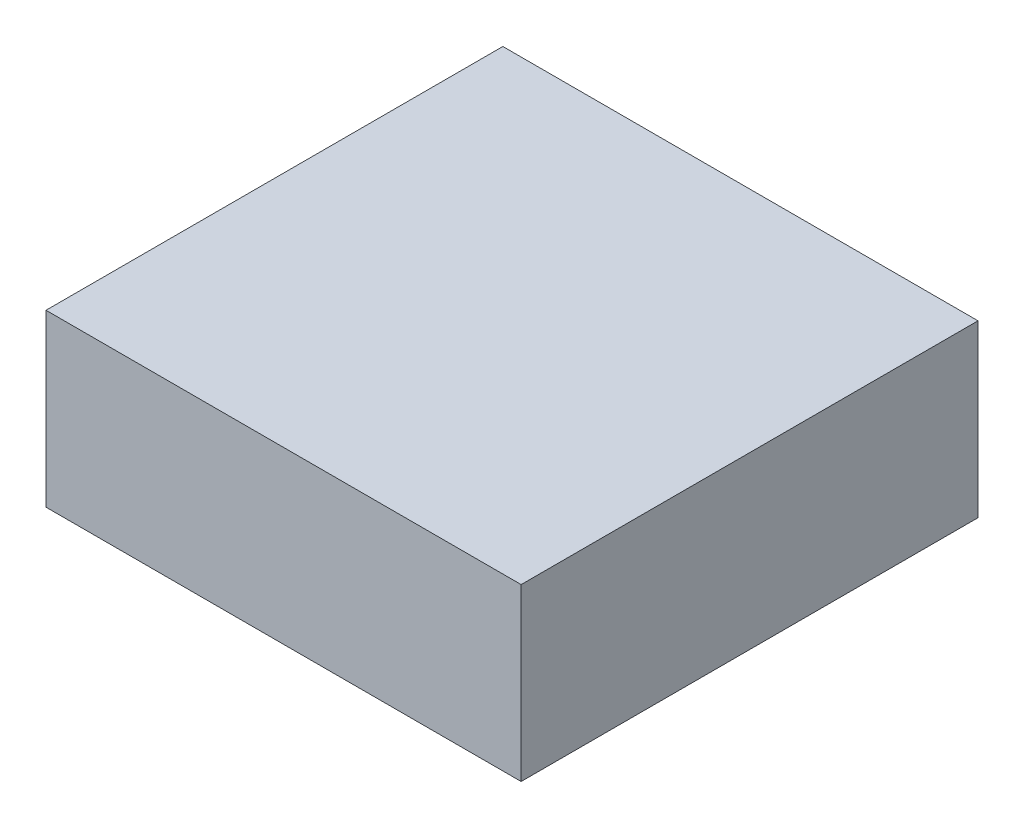
ISO-10303-21;
HEADER;
FILE_DESCRIPTION(('STEP AP214'),'2;1');
FILE_NAME('part.step','',(''),(''),'','','');
FILE_SCHEMA(('AUTOMOTIVE_DESIGN { 1 0 10303 214 1 1 1 1 }'));
ENDSEC;
DATA;
#1=APPLICATION_CONTEXT('core data for automotive mechanical design processes');
#2=APPLICATION_PROTOCOL_DEFINITION('international standard','automotive_design',2000,#1);
#3=PRODUCT_CONTEXT('',#1,'mechanical');
#4=PRODUCT('Part','Part','',(#3));
#5=PRODUCT_RELATED_PRODUCT_CATEGORY('part','',(#4));
#6=PRODUCT_DEFINITION_FORMATION('','',#4);
#7=PRODUCT_DEFINITION_CONTEXT('part definition',#1,'design');
#8=PRODUCT_DEFINITION('design','',#6,#7);
#9=PRODUCT_DEFINITION_SHAPE('','',#8);
#10=(LENGTH_UNIT() NAMED_UNIT(*) SI_UNIT(.MILLI.,.METRE.));
#11=(NAMED_UNIT(*) PLANE_ANGLE_UNIT() SI_UNIT($,.RADIAN.));
#12=(NAMED_UNIT(*) SI_UNIT($,.STERADIAN.) SOLID_ANGLE_UNIT());
#13=UNCERTAINTY_MEASURE_WITH_UNIT(LENGTH_MEASURE(1.E-05),#10,'distance_accuracy_value','');
#14=(GEOMETRIC_REPRESENTATION_CONTEXT(3) GLOBAL_UNCERTAINTY_ASSIGNED_CONTEXT((#13)) GLOBAL_UNIT_ASSIGNED_CONTEXT((#10,
#11,#12)) REPRESENTATION_CONTEXT('',''));
#15=CARTESIAN_POINT('',(0.,0.,0.));
#16=DIRECTION('',(0.,0.,1.));
#17=DIRECTION('',(1.,0.,0.));
#18=AXIS2_PLACEMENT_3D('',#15,#16,#17);
#19=CARTESIAN_POINT('',(0.,28.,-75.));
#20=DIRECTION('',(0.,0.,-1.));
#21=DIRECTION('',(-1.,0.,0.));
#22=AXIS2_PLACEMENT_3D('',#19,#20,#21);
#23=PLANE('',#22);
#24=DIRECTION('',(1.,0.,0.));
#25=VECTOR('',#24,1.);
#26=CARTESIAN_POINT('',(0.,0.,-75.));
#27=LINE('',#26,#25);
#28=CARTESIAN_POINT('',(0.,0.,-75.));
#29=VERTEX_POINT('',#28);
#30=CARTESIAN_POINT('',(78.,0.,-75.));
#31=VERTEX_POINT('',#30);
#32=EDGE_CURVE('E98',#29,#31,#27,.T.);
#33=ORIENTED_EDGE('',*,*,#32,.F.);
#34=DIRECTION('',(0.,-1.,0.));
#35=VECTOR('',#34,1.);
#36=CARTESIAN_POINT('',(0.,28.,-75.));
#37=LINE('',#36,#35);
#38=CARTESIAN_POINT('',(0.,28.,-75.));
#39=VERTEX_POINT('',#38);
#40=EDGE_CURVE('E11',#39,#29,#37,.T.);
#41=ORIENTED_EDGE('',*,*,#40,.F.);
#42=DIRECTION('',(1.,0.,0.));
#43=VECTOR('',#42,1.);
#44=CARTESIAN_POINT('',(0.,28.,-75.));
#45=LINE('',#44,#43);
#46=CARTESIAN_POINT('',(78.,28.,-75.));
#47=VERTEX_POINT('',#46);
#48=EDGE_CURVE('E92',#39,#47,#45,.T.);
#49=ORIENTED_EDGE('',*,*,#48,.T.);
#50=DIRECTION('',(0.,-1.,0.));
#51=VECTOR('',#50,1.);
#52=CARTESIAN_POINT('',(78.,28.,-75.));
#53=LINE('',#52,#51);
#54=EDGE_CURVE('E37',#47,#31,#53,.T.);
#55=ORIENTED_EDGE('',*,*,#54,.T.);
#56=EDGE_LOOP('',(#33,#41,#49,#55));
#57=FACE_BOUND('',#56,.T.);
#58=ADVANCED_FACE('F34',(#57),#23,.T.);
#59=CARTESIAN_POINT('',(0.,28.,0.));
#60=DIRECTION('',(-1.,0.,0.));
#61=DIRECTION('',(0.,0.,1.));
#62=AXIS2_PLACEMENT_3D('',#59,#60,#61);
#63=PLANE('',#62);
#64=DIRECTION('',(0.,0.,-1.));
#65=VECTOR('',#64,1.);
#66=CARTESIAN_POINT('',(0.,0.,0.));
#67=LINE('',#66,#65);
#68=CARTESIAN_POINT('',(0.,0.,0.));
#69=VERTEX_POINT('',#68);
#70=EDGE_CURVE('E94',#69,#29,#67,.T.);
#71=ORIENTED_EDGE('',*,*,#70,.F.);
#72=DIRECTION('',(0.,-1.,0.));
#73=VECTOR('',#72,1.);
#74=CARTESIAN_POINT('',(0.,28.,0.));
#75=LINE('',#74,#73);
#76=CARTESIAN_POINT('',(0.,28.,0.));
#77=VERTEX_POINT('',#76);
#78=EDGE_CURVE('E43',#77,#69,#75,.T.);
#79=ORIENTED_EDGE('',*,*,#78,.F.);
#80=DIRECTION('',(0.,0.,-1.));
#81=VECTOR('',#80,1.);
#82=CARTESIAN_POINT('',(0.,28.,0.));
#83=LINE('',#82,#81);
#84=EDGE_CURVE('E82',#77,#39,#83,.T.);
#85=ORIENTED_EDGE('',*,*,#84,.T.);
#86=ORIENTED_EDGE('',*,*,#40,.T.);
#87=EDGE_LOOP('',(#71,#79,#85,#86));
#88=FACE_BOUND('',#87,.T.);
#89=ADVANCED_FACE('F108',(#88),#63,.T.);
#90=CARTESIAN_POINT('',(0.,28.,0.));
#91=DIRECTION('',(0.,0.,-1.));
#92=DIRECTION('',(-1.,0.,0.));
#93=AXIS2_PLACEMENT_3D('',#90,#91,#92);
#94=PLANE('',#93);
#95=DIRECTION('',(1.,0.,0.));
#96=VECTOR('',#95,1.);
#97=CARTESIAN_POINT('',(0.,0.,0.));
#98=LINE('',#97,#96);
#99=CARTESIAN_POINT('',(78.,0.,0.));
#100=VERTEX_POINT('',#99);
#101=EDGE_CURVE('E87',#69,#100,#98,.T.);
#102=ORIENTED_EDGE('',*,*,#101,.T.);
#103=DIRECTION('',(0.,-1.,0.));
#104=VECTOR('',#103,1.);
#105=CARTESIAN_POINT('',(78.,28.,0.));
#106=LINE('',#105,#104);
#107=CARTESIAN_POINT('',(78.,28.,0.));
#108=VERTEX_POINT('',#107);
#109=EDGE_CURVE('E85',#108,#100,#106,.T.);
#110=ORIENTED_EDGE('',*,*,#109,.F.);
#111=DIRECTION('',(1.,0.,0.));
#112=VECTOR('',#111,1.);
#113=CARTESIAN_POINT('',(0.,28.,0.));
#114=LINE('',#113,#112);
#115=EDGE_CURVE('E79',#77,#108,#114,.T.);
#116=ORIENTED_EDGE('',*,*,#115,.F.);
#117=ORIENTED_EDGE('',*,*,#78,.T.);
#118=EDGE_LOOP('',(#102,#110,#116,#117));
#119=FACE_BOUND('',#118,.T.);
#120=ADVANCED_FACE('F86',(#119),#94,.F.);
#121=CARTESIAN_POINT('',(78.,28.,0.));
#122=DIRECTION('',(-1.,0.,0.));
#123=DIRECTION('',(0.,0.,1.));
#124=AXIS2_PLACEMENT_3D('',#121,#122,#123);
#125=PLANE('',#124);
#126=DIRECTION('',(0.,0.,-1.));
#127=VECTOR('',#126,1.);
#128=CARTESIAN_POINT('',(78.,0.,0.));
#129=LINE('',#128,#127);
#130=EDGE_CURVE('E101',#100,#31,#129,.T.);
#131=ORIENTED_EDGE('',*,*,#130,.T.);
#132=ORIENTED_EDGE('',*,*,#54,.F.);
#133=DIRECTION('',(0.,0.,-1.));
#134=VECTOR('',#133,1.);
#135=CARTESIAN_POINT('',(78.,28.,0.));
#136=LINE('',#135,#134);
#137=EDGE_CURVE('E76',#108,#47,#136,.T.);
#138=ORIENTED_EDGE('',*,*,#137,.F.);
#139=ORIENTED_EDGE('',*,*,#109,.T.);
#140=EDGE_LOOP('',(#131,#132,#138,#139));
#141=FACE_BOUND('',#140,.T.);
#142=ADVANCED_FACE('F91',(#141),#125,.F.);
#143=CARTESIAN_POINT('',(0.,28.,0.));
#144=DIRECTION('',(0.,1.,0.));
#145=DIRECTION('',(0.,0.,1.));
#146=AXIS2_PLACEMENT_3D('',#143,#144,#145);
#147=PLANE('',#146);
#148=ORIENTED_EDGE('',*,*,#48,.F.);
#149=ORIENTED_EDGE('',*,*,#84,.F.);
#150=ORIENTED_EDGE('',*,*,#115,.T.);
#151=ORIENTED_EDGE('',*,*,#137,.T.);
#152=EDGE_LOOP('',(#148,#149,#150,#151));
#153=FACE_BOUND('',#152,.T.);
#154=ADVANCED_FACE('F81',(#153),#147,.T.);
#155=CARTESIAN_POINT('',(0.,0.,0.));
#156=DIRECTION('',(0.,1.,0.));
#157=DIRECTION('',(0.,0.,1.));
#158=AXIS2_PLACEMENT_3D('',#155,#156,#157);
#159=PLANE('',#158);
#160=ORIENTED_EDGE('',*,*,#32,.T.);
#161=ORIENTED_EDGE('',*,*,#130,.F.);
#162=ORIENTED_EDGE('',*,*,#101,.F.);
#163=ORIENTED_EDGE('',*,*,#70,.T.);
#164=EDGE_LOOP('',(#160,#161,#162,#163));
#165=FACE_BOUND('',#164,.T.);
#166=ADVANCED_FACE('F107',(#165),#159,.F.);
#167=CLOSED_SHELL('',(#58,#89,#120,#142,#154,#166));
#168=MANIFOLD_SOLID_BREP('B2',#167);
#169=ADVANCED_BREP_SHAPE_REPRESENTATION('',(#18,#168),#14);
#170=SHAPE_DEFINITION_REPRESENTATION(#9,#169);
ENDSEC;
END-ISO-10303-21;
